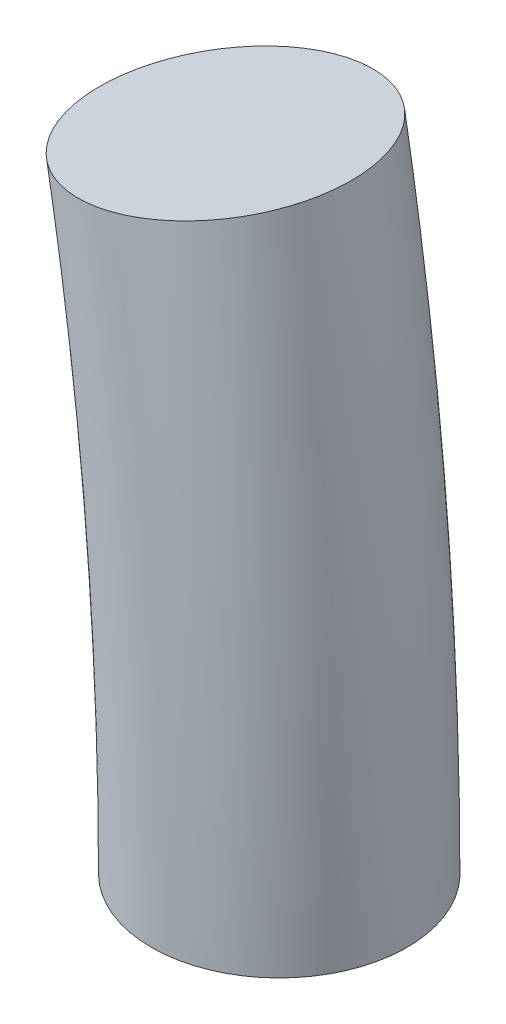
ISO-10303-21;
HEADER;
FILE_DESCRIPTION(('STEP AP214'),'2;1');
FILE_NAME('part.step','',(''),(''),'','','');
FILE_SCHEMA(('AUTOMOTIVE_DESIGN { 1 0 10303 214 1 1 1 1 }'));
ENDSEC;
DATA;
#1=APPLICATION_CONTEXT('core data for automotive mechanical design processes');
#2=APPLICATION_PROTOCOL_DEFINITION('international standard','automotive_design',2000,#1);
#3=PRODUCT_CONTEXT('',#1,'mechanical');
#4=PRODUCT('Part','Part','',(#3));
#5=PRODUCT_RELATED_PRODUCT_CATEGORY('part','',(#4));
#6=PRODUCT_DEFINITION_FORMATION('','',#4);
#7=PRODUCT_DEFINITION_CONTEXT('part definition',#1,'design');
#8=PRODUCT_DEFINITION('design','',#6,#7);
#9=PRODUCT_DEFINITION_SHAPE('','',#8);
#10=(LENGTH_UNIT() NAMED_UNIT(*) SI_UNIT(.MILLI.,.METRE.));
#11=(NAMED_UNIT(*) PLANE_ANGLE_UNIT() SI_UNIT($,.RADIAN.));
#12=(NAMED_UNIT(*) SI_UNIT($,.STERADIAN.) SOLID_ANGLE_UNIT());
#13=UNCERTAINTY_MEASURE_WITH_UNIT(LENGTH_MEASURE(1.E-05),#10,'distance_accuracy_value','');
#14=(GEOMETRIC_REPRESENTATION_CONTEXT(3) GLOBAL_UNCERTAINTY_ASSIGNED_CONTEXT((#13)) GLOBAL_UNIT_ASSIGNED_CONTEXT((#10,
#11,#12)) REPRESENTATION_CONTEXT('',''));
#15=CARTESIAN_POINT('',(0.,0.,0.));
#16=DIRECTION('',(0.,0.,1.));
#17=DIRECTION('',(1.,0.,0.));
#18=AXIS2_PLACEMENT_3D('',#15,#16,#17);
#19=CARTESIAN_POINT('',(41.5,0.,0.));
#20=DIRECTION('',(0.,1.,0.));
#21=DIRECTION('',(0.,0.,1.));
#22=AXIS2_PLACEMENT_3D('',#19,#20,#21);
#23=PLANE('',#22);
#24=CARTESIAN_POINT('',(41.5,0.,0.));
#25=DIRECTION('',(0.,1.,0.));
#26=DIRECTION('',(0.,0.,1.));
#27=AXIS2_PLACEMENT_3D('',#24,#25,#26);
#28=CIRCLE('',#27,1.5);
#29=CARTESIAN_POINT('',(41.5,0.,1.5));
#30=VERTEX_POINT('',#29);
#31=EDGE_CURVE('E44',#30,#30,#28,.T.);
#32=ORIENTED_EDGE('',*,*,#31,.F.);
#33=EDGE_LOOP('',(#32));
#34=FACE_BOUND('',#33,.T.);
#35=ADVANCED_FACE('F37',(#34),#23,.F.);
#36=CARTESIAN_POINT('',(40.8695217500066,7.20639937317764,0.));
#37=DIRECTION('',(-0.173648177666931,0.984807753012208,0.));
#38=DIRECTION('',(0.,0.,1.));
#39=AXIS2_PLACEMENT_3D('',#36,#37,#38);
#40=PLANE('',#39);
#41=CARTESIAN_POINT('',(40.8695217500066,7.20639937317764,0.));
#42=DIRECTION('',(-0.173648177666931,0.984807753012208,0.));
#43=DIRECTION('',(0.,0.,1.));
#44=AXIS2_PLACEMENT_3D('',#41,#42,#43);
#45=CIRCLE('',#44,1.5);
#46=CARTESIAN_POINT('',(40.8695217500066,7.20639937317764,1.5));
#47=VERTEX_POINT('',#46);
#48=EDGE_CURVE('E11',#47,#47,#45,.T.);
#49=ORIENTED_EDGE('',*,*,#48,.T.);
#50=EDGE_LOOP('',(#49));
#51=FACE_BOUND('',#50,.T.);
#52=ADVANCED_FACE('F51',(#51),#40,.T.);
#53=CARTESIAN_POINT('',(0.,0.,0.));
#54=DIRECTION('',(0.,0.,1.));
#55=DIRECTION('',(1.,0.,0.));
#56=AXIS2_PLACEMENT_3D('',#53,#54,#55);
#57=TOROIDAL_SURFACE('',#56,41.5,1.5);
#58=ORIENTED_EDGE('',*,*,#48,.F.);
#59=EDGE_LOOP('',(#58));
#60=FACE_BOUND('',#59,.T.);
#61=ORIENTED_EDGE('',*,*,#31,.T.);
#62=EDGE_LOOP('',(#61));
#63=FACE_BOUND('',#62,.T.);
#64=ADVANCED_FACE('F53',(#60,#63),#57,.T.);
#65=CLOSED_SHELL('',(#35,#52,#64));
#66=MANIFOLD_SOLID_BREP('B2',#65);
#67=ADVANCED_BREP_SHAPE_REPRESENTATION('',(#18,#66),#14);
#68=SHAPE_DEFINITION_REPRESENTATION(#9,#67);
ENDSEC;
END-ISO-10303-21;
